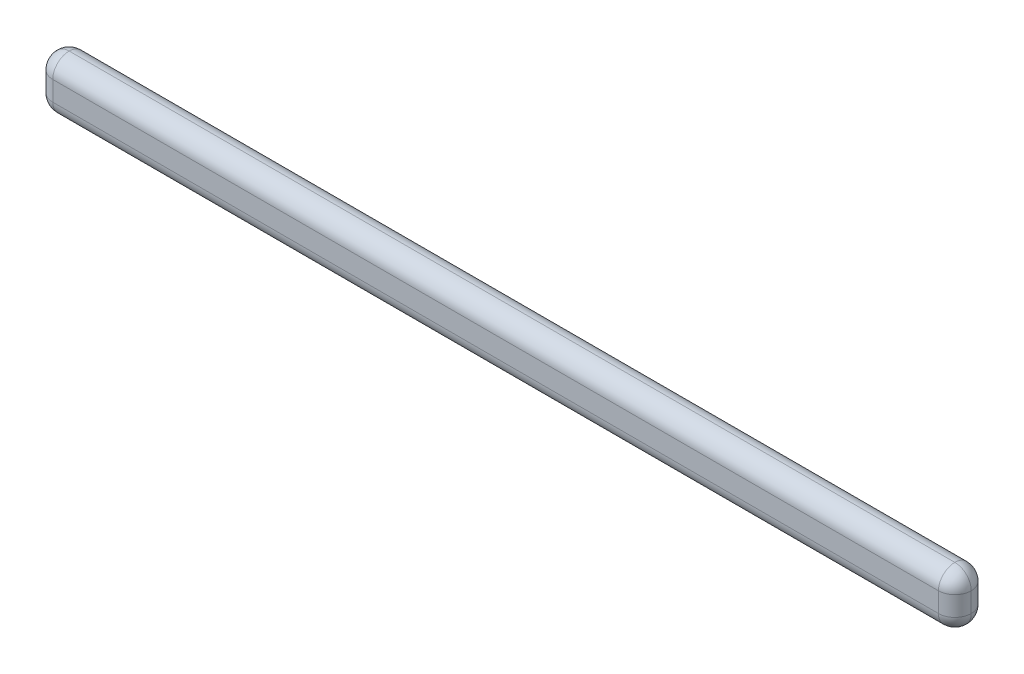
ISO-10303-21;
HEADER;
FILE_DESCRIPTION(('STEP AP214'),'2;1');
FILE_NAME('part.step','',(''),(''),'','','');
FILE_SCHEMA(('AUTOMOTIVE_DESIGN { 1 0 10303 214 1 1 1 1 }'));
ENDSEC;
DATA;
#1=APPLICATION_CONTEXT('core data for automotive mechanical design processes');
#2=APPLICATION_PROTOCOL_DEFINITION('international standard','automotive_design',2000,#1);
#3=PRODUCT_CONTEXT('',#1,'mechanical');
#4=PRODUCT('Part','Part','',(#3));
#5=PRODUCT_RELATED_PRODUCT_CATEGORY('part','',(#4));
#6=PRODUCT_DEFINITION_FORMATION('','',#4);
#7=PRODUCT_DEFINITION_CONTEXT('part definition',#1,'design');
#8=PRODUCT_DEFINITION('design','',#6,#7);
#9=PRODUCT_DEFINITION_SHAPE('','',#8);
#10=(LENGTH_UNIT() NAMED_UNIT(*) SI_UNIT(.MILLI.,.METRE.));
#11=(NAMED_UNIT(*) PLANE_ANGLE_UNIT() SI_UNIT($,.RADIAN.));
#12=(NAMED_UNIT(*) SI_UNIT($,.STERADIAN.) SOLID_ANGLE_UNIT());
#13=UNCERTAINTY_MEASURE_WITH_UNIT(LENGTH_MEASURE(1.E-05),#10,'distance_accuracy_value','');
#14=(GEOMETRIC_REPRESENTATION_CONTEXT(3) GLOBAL_UNCERTAINTY_ASSIGNED_CONTEXT((#13)) GLOBAL_UNIT_ASSIGNED_CONTEXT((#10,
#11,#12)) REPRESENTATION_CONTEXT('',''));
#15=CARTESIAN_POINT('',(0.,0.,0.));
#16=DIRECTION('',(0.,0.,1.));
#17=DIRECTION('',(1.,0.,0.));
#18=AXIS2_PLACEMENT_3D('',#15,#16,#17);
#19=CARTESIAN_POINT('',(0.,0.,-12.5));
#20=DIRECTION('',(0.,0.,-1.));
#21=DIRECTION('',(-1.,0.,0.));
#22=AXIS2_PLACEMENT_3D('',#19,#20,#21);
#23=PLANE('',#22);
#24=DIRECTION('',(1.,0.,0.));
#25=VECTOR('',#24,1.);
#26=CARTESIAN_POINT('',(0.,-7.5,-12.5));
#27=LINE('',#26,#25);
#28=CARTESIAN_POINT('',(337.5,-7.5,-12.5));
#29=VERTEX_POINT('',#28);
#30=CARTESIAN_POINT('',(-337.5,-7.5,-12.5));
#31=VERTEX_POINT('',#30);
#32=EDGE_CURVE('E168',#29,#31,#27,.F.);
#33=ORIENTED_EDGE('',*,*,#32,.T.);
#34=DIRECTION('',(0.,-1.,0.));
#35=VECTOR('',#34,1.);
#36=CARTESIAN_POINT('',(-337.5,0.,-12.5));
#37=LINE('',#36,#35);
#38=CARTESIAN_POINT('',(-337.5,7.5,-12.5));
#39=VERTEX_POINT('',#38);
#40=EDGE_CURVE('E11',#31,#39,#37,.F.);
#41=ORIENTED_EDGE('',*,*,#40,.T.);
#42=DIRECTION('',(-1.,0.,0.));
#43=VECTOR('',#42,1.);
#44=CARTESIAN_POINT('',(0.,7.5,-12.5));
#45=LINE('',#44,#43);
#46=CARTESIAN_POINT('',(337.5,7.5,-12.5));
#47=VERTEX_POINT('',#46);
#48=EDGE_CURVE('E163',#39,#47,#45,.F.);
#49=ORIENTED_EDGE('',*,*,#48,.T.);
#50=DIRECTION('',(0.,1.,0.));
#51=VECTOR('',#50,1.);
#52=CARTESIAN_POINT('',(337.5,0.,-12.5));
#53=LINE('',#52,#51);
#54=EDGE_CURVE('E45',#47,#29,#53,.F.);
#55=ORIENTED_EDGE('',*,*,#54,.T.);
#56=EDGE_LOOP('',(#33,#41,#49,#55));
#57=FACE_BOUND('',#56,.T.);
#58=ADVANCED_FACE('F35',(#57),#23,.T.);
#59=CARTESIAN_POINT('',(0.,0.,12.5));
#60=DIRECTION('',(0.,0.,-1.));
#61=DIRECTION('',(-1.,0.,0.));
#62=AXIS2_PLACEMENT_3D('',#59,#60,#61);
#63=PLANE('',#62);
#64=DIRECTION('',(-1.,0.,0.));
#65=VECTOR('',#64,1.);
#66=CARTESIAN_POINT('',(-350.,7.5,12.5));
#67=LINE('',#66,#65);
#68=CARTESIAN_POINT('',(337.5,7.5,12.5));
#69=VERTEX_POINT('',#68);
#70=CARTESIAN_POINT('',(-337.5,7.5,12.5));
#71=VERTEX_POINT('',#70);
#72=EDGE_CURVE('E166',#69,#71,#67,.T.);
#73=ORIENTED_EDGE('',*,*,#72,.T.);
#74=DIRECTION('',(0.,-1.,0.));
#75=VECTOR('',#74,1.);
#76=CARTESIAN_POINT('',(-337.5,-7.5,12.5));
#77=LINE('',#76,#75);
#78=CARTESIAN_POINT('',(-337.5,-7.5,12.5));
#79=VERTEX_POINT('',#78);
#80=EDGE_CURVE('E134',#71,#79,#77,.T.);
#81=ORIENTED_EDGE('',*,*,#80,.T.);
#82=DIRECTION('',(1.,0.,0.));
#83=VECTOR('',#82,1.);
#84=CARTESIAN_POINT('',(350.,-7.5,12.5));
#85=LINE('',#84,#83);
#86=CARTESIAN_POINT('',(337.5,-7.5,12.5));
#87=VERTEX_POINT('',#86);
#88=EDGE_CURVE('E157',#79,#87,#85,.T.);
#89=ORIENTED_EDGE('',*,*,#88,.T.);
#90=DIRECTION('',(0.,1.,0.));
#91=VECTOR('',#90,1.);
#92=CARTESIAN_POINT('',(337.5,7.5,12.5));
#93=LINE('',#92,#91);
#94=EDGE_CURVE('E137',#87,#69,#93,.T.);
#95=ORIENTED_EDGE('',*,*,#94,.T.);
#96=EDGE_LOOP('',(#73,#81,#89,#95));
#97=FACE_BOUND('',#96,.T.);
#98=ADVANCED_FACE('F219',(#97),#63,.F.);
#99=CARTESIAN_POINT('',(0.,-7.5,0.));
#100=DIRECTION('',(-1.,0.,0.));
#101=DIRECTION('',(0.,0.,1.));
#102=AXIS2_PLACEMENT_3D('',#99,#100,#101);
#103=CYLINDRICAL_SURFACE('',#102,12.5);
#104=ORIENTED_EDGE('',*,*,#88,.F.);
#105=CARTESIAN_POINT('',(-337.5,-7.5,0.));
#106=DIRECTION('',(-1.,0.,0.));
#107=DIRECTION('',(0.,0.,1.));
#108=AXIS2_PLACEMENT_3D('',#105,#106,#107);
#109=CIRCLE('',#108,12.5);
#110=CARTESIAN_POINT('',(-337.5,-20.,0.));
#111=VERTEX_POINT('',#110);
#112=EDGE_CURVE('E147',#79,#111,#109,.F.);
#113=ORIENTED_EDGE('',*,*,#112,.T.);
#114=DIRECTION('',(1.,0.,0.));
#115=VECTOR('',#114,1.);
#116=CARTESIAN_POINT('',(-350.,-20.,0.));
#117=LINE('',#116,#115);
#118=CARTESIAN_POINT('',(337.5,-20.,0.));
#119=VERTEX_POINT('',#118);
#120=EDGE_CURVE('E160',#119,#111,#117,.F.);
#121=ORIENTED_EDGE('',*,*,#120,.F.);
#122=CARTESIAN_POINT('',(337.5,-7.5,0.));
#123=DIRECTION('',(-1.,0.,0.));
#124=DIRECTION('',(0.,0.,1.));
#125=AXIS2_PLACEMENT_3D('',#122,#123,#124);
#126=CIRCLE('',#125,12.5);
#127=EDGE_CURVE('E150',#119,#87,#126,.T.);
#128=ORIENTED_EDGE('',*,*,#127,.T.);
#129=EDGE_LOOP('',(#104,#113,#121,#128));
#130=FACE_BOUND('',#129,.T.);
#131=ADVANCED_FACE('F221',(#130),#103,.T.);
#132=CARTESIAN_POINT('',(350.,-7.5,0.));
#133=DIRECTION('',(1.,0.,0.));
#134=DIRECTION('',(0.,0.,-1.));
#135=AXIS2_PLACEMENT_3D('',#132,#133,#134);
#136=CYLINDRICAL_SURFACE('',#135,12.5);
#137=ORIENTED_EDGE('',*,*,#120,.T.);
#138=CARTESIAN_POINT('',(-337.5,-7.5,0.));
#139=DIRECTION('',(1.,0.,0.));
#140=DIRECTION('',(0.,0.,-1.));
#141=AXIS2_PLACEMENT_3D('',#138,#139,#140);
#142=CIRCLE('',#141,12.5);
#143=EDGE_CURVE('E141',#111,#31,#142,.T.);
#144=ORIENTED_EDGE('',*,*,#143,.T.);
#145=ORIENTED_EDGE('',*,*,#32,.F.);
#146=CARTESIAN_POINT('',(337.5,-7.5,0.));
#147=DIRECTION('',(1.,0.,0.));
#148=DIRECTION('',(0.,0.,-1.));
#149=AXIS2_PLACEMENT_3D('',#146,#147,#148);
#150=CIRCLE('',#149,12.5);
#151=EDGE_CURVE('E144',#29,#119,#150,.F.);
#152=ORIENTED_EDGE('',*,*,#151,.T.);
#153=EDGE_LOOP('',(#137,#144,#145,#152));
#154=FACE_BOUND('',#153,.T.);
#155=ADVANCED_FACE('F207',(#154),#136,.T.);
#156=CARTESIAN_POINT('',(0.,7.5,0.));
#157=DIRECTION('',(1.,0.,0.));
#158=DIRECTION('',(0.,0.,-1.));
#159=AXIS2_PLACEMENT_3D('',#156,#157,#158);
#160=CYLINDRICAL_SURFACE('',#159,12.5);
#161=ORIENTED_EDGE('',*,*,#72,.F.);
#162=CARTESIAN_POINT('',(337.5,7.5,0.));
#163=DIRECTION('',(1.,0.,0.));
#164=DIRECTION('',(0.,0.,-1.));
#165=AXIS2_PLACEMENT_3D('',#162,#163,#164);
#166=CIRCLE('',#165,12.5);
#167=CARTESIAN_POINT('',(337.5,20.,0.));
#168=VERTEX_POINT('',#167);
#169=EDGE_CURVE('E96',#69,#168,#166,.F.);
#170=ORIENTED_EDGE('',*,*,#169,.T.);
#171=DIRECTION('',(-1.,0.,0.));
#172=VECTOR('',#171,1.);
#173=CARTESIAN_POINT('',(350.,20.,0.));
#174=LINE('',#173,#172);
#175=CARTESIAN_POINT('',(-337.5,20.,0.));
#176=VERTEX_POINT('',#175);
#177=EDGE_CURVE('E115',#176,#168,#174,.F.);
#178=ORIENTED_EDGE('',*,*,#177,.F.);
#179=CARTESIAN_POINT('',(-337.5,7.5,0.));
#180=DIRECTION('',(1.,0.,0.));
#181=DIRECTION('',(0.,0.,-1.));
#182=AXIS2_PLACEMENT_3D('',#179,#180,#181);
#183=CIRCLE('',#182,12.5);
#184=EDGE_CURVE('E54',#176,#71,#183,.T.);
#185=ORIENTED_EDGE('',*,*,#184,.T.);
#186=EDGE_LOOP('',(#161,#170,#178,#185));
#187=FACE_BOUND('',#186,.T.);
#188=ADVANCED_FACE('F246',(#187),#160,.T.);
#189=CARTESIAN_POINT('',(-350.,7.5,0.));
#190=DIRECTION('',(-1.,0.,0.));
#191=DIRECTION('',(0.,0.,1.));
#192=AXIS2_PLACEMENT_3D('',#189,#190,#191);
#193=CYLINDRICAL_SURFACE('',#192,12.5);
#194=ORIENTED_EDGE('',*,*,#48,.F.);
#195=CARTESIAN_POINT('',(-337.5,7.5,0.));
#196=DIRECTION('',(-1.,0.,0.));
#197=DIRECTION('',(0.,0.,1.));
#198=AXIS2_PLACEMENT_3D('',#195,#196,#197);
#199=CIRCLE('',#198,12.5);
#200=EDGE_CURVE('E153',#39,#176,#199,.F.);
#201=ORIENTED_EDGE('',*,*,#200,.T.);
#202=ORIENTED_EDGE('',*,*,#177,.T.);
#203=CARTESIAN_POINT('',(337.5,7.5,0.));
#204=DIRECTION('',(-1.,0.,0.));
#205=DIRECTION('',(0.,0.,1.));
#206=AXIS2_PLACEMENT_3D('',#203,#204,#205);
#207=CIRCLE('',#206,12.5);
#208=EDGE_CURVE('E85',#168,#47,#207,.T.);
#209=ORIENTED_EDGE('',*,*,#208,.T.);
#210=EDGE_LOOP('',(#194,#201,#202,#209));
#211=FACE_BOUND('',#210,.T.);
#212=ADVANCED_FACE('F181',(#211),#193,.T.);
#213=CARTESIAN_POINT('',(-337.5,-7.5,0.));
#214=DIRECTION('',(-1.,0.,0.));
#215=DIRECTION('',(0.,0.,1.));
#216=AXIS2_PLACEMENT_3D('',#213,#214,#215);
#217=SPHERICAL_SURFACE('',#216,12.5);
#218=CARTESIAN_POINT('',(-337.5,-7.5,0.));
#219=DIRECTION('',(0.,0.,-1.));
#220=DIRECTION('',(-1.,0.,0.));
#221=AXIS2_PLACEMENT_3D('',#218,#219,#220);
#222=CIRCLE('',#221,12.5);
#223=CARTESIAN_POINT('',(-350.,-7.5,0.));
#224=VERTEX_POINT('',#223);
#225=EDGE_CURVE('E116',#111,#224,#222,.T.);
#226=ORIENTED_EDGE('',*,*,#225,.F.);
#227=ORIENTED_EDGE('',*,*,#112,.F.);
#228=CARTESIAN_POINT('',(-337.5,-7.5,0.));
#229=DIRECTION('',(0.,1.,0.));
#230=DIRECTION('',(0.,0.,1.));
#231=AXIS2_PLACEMENT_3D('',#228,#229,#230);
#232=CIRCLE('',#231,12.5);
#233=EDGE_CURVE('E112',#224,#79,#232,.T.);
#234=ORIENTED_EDGE('',*,*,#233,.F.);
#235=EDGE_LOOP('',(#226,#227,#234));
#236=FACE_BOUND('',#235,.T.);
#237=ADVANCED_FACE('F214',(#236),#217,.T.);
#238=CARTESIAN_POINT('',(-337.5,0.,0.));
#239=DIRECTION('',(0.,1.,0.));
#240=DIRECTION('',(0.,0.,1.));
#241=AXIS2_PLACEMENT_3D('',#238,#239,#240);
#242=CYLINDRICAL_SURFACE('',#241,12.5);
#243=ORIENTED_EDGE('',*,*,#233,.T.);
#244=ORIENTED_EDGE('',*,*,#80,.F.);
#245=CARTESIAN_POINT('',(-337.5,7.5,0.));
#246=DIRECTION('',(0.,1.,0.));
#247=DIRECTION('',(0.,0.,1.));
#248=AXIS2_PLACEMENT_3D('',#245,#246,#247);
#249=CIRCLE('',#248,12.5);
#250=CARTESIAN_POINT('',(-350.,7.5,0.));
#251=VERTEX_POINT('',#250);
#252=EDGE_CURVE('E119',#251,#71,#249,.T.);
#253=ORIENTED_EDGE('',*,*,#252,.F.);
#254=DIRECTION('',(0.,-1.,0.));
#255=VECTOR('',#254,1.);
#256=CARTESIAN_POINT('',(-350.,7.5,0.));
#257=LINE('',#256,#255);
#258=EDGE_CURVE('E122',#224,#251,#257,.F.);
#259=ORIENTED_EDGE('',*,*,#258,.F.);
#260=EDGE_LOOP('',(#243,#244,#253,#259));
#261=FACE_BOUND('',#260,.T.);
#262=ADVANCED_FACE('F216',(#261),#242,.T.);
#263=CARTESIAN_POINT('',(-337.5,-7.5,0.));
#264=DIRECTION('',(-1.,0.,0.));
#265=DIRECTION('',(0.,0.,1.));
#266=AXIS2_PLACEMENT_3D('',#263,#264,#265);
#267=SPHERICAL_SURFACE('',#266,12.5);
#268=ORIENTED_EDGE('',*,*,#143,.F.);
#269=ORIENTED_EDGE('',*,*,#225,.T.);
#270=CARTESIAN_POINT('',(-337.5,-7.5,0.));
#271=DIRECTION('',(0.,1.,0.));
#272=DIRECTION('',(0.,0.,1.));
#273=AXIS2_PLACEMENT_3D('',#270,#271,#272);
#274=CIRCLE('',#273,12.5);
#275=EDGE_CURVE('E125',#31,#224,#274,.T.);
#276=ORIENTED_EDGE('',*,*,#275,.F.);
#277=EDGE_LOOP('',(#268,#269,#276));
#278=FACE_BOUND('',#277,.T.);
#279=ADVANCED_FACE('F211',(#278),#267,.T.);
#280=CARTESIAN_POINT('',(-337.5,7.5,0.));
#281=DIRECTION('',(-1.,0.,0.));
#282=DIRECTION('',(0.,0.,1.));
#283=AXIS2_PLACEMENT_3D('',#280,#281,#282);
#284=SPHERICAL_SURFACE('',#283,12.5);
#285=ORIENTED_EDGE('',*,*,#252,.T.);
#286=ORIENTED_EDGE('',*,*,#184,.F.);
#287=CARTESIAN_POINT('',(-337.5,7.5,0.));
#288=DIRECTION('',(0.,0.,-1.));
#289=DIRECTION('',(-1.,0.,0.));
#290=AXIS2_PLACEMENT_3D('',#287,#288,#289);
#291=CIRCLE('',#290,12.5);
#292=EDGE_CURVE('E128',#251,#176,#291,.T.);
#293=ORIENTED_EDGE('',*,*,#292,.F.);
#294=EDGE_LOOP('',(#285,#286,#293));
#295=FACE_BOUND('',#294,.T.);
#296=ADVANCED_FACE('F193',(#295),#284,.T.);
#297=CARTESIAN_POINT('',(-337.5,-20.,0.));
#298=DIRECTION('',(0.,-1.,0.));
#299=DIRECTION('',(0.,0.,-1.));
#300=AXIS2_PLACEMENT_3D('',#297,#298,#299);
#301=CYLINDRICAL_SURFACE('',#300,12.5);
#302=ORIENTED_EDGE('',*,*,#275,.T.);
#303=ORIENTED_EDGE('',*,*,#258,.T.);
#304=CARTESIAN_POINT('',(-337.5,7.5,0.));
#305=DIRECTION('',(0.,1.,0.));
#306=DIRECTION('',(0.,0.,1.));
#307=AXIS2_PLACEMENT_3D('',#304,#305,#306);
#308=CIRCLE('',#307,12.5);
#309=EDGE_CURVE('E89',#39,#251,#308,.T.);
#310=ORIENTED_EDGE('',*,*,#309,.F.);
#311=ORIENTED_EDGE('',*,*,#40,.F.);
#312=EDGE_LOOP('',(#302,#303,#310,#311));
#313=FACE_BOUND('',#312,.T.);
#314=ADVANCED_FACE('F188',(#313),#301,.T.);
#315=CARTESIAN_POINT('',(-337.5,7.5,0.));
#316=DIRECTION('',(-1.,0.,0.));
#317=DIRECTION('',(0.,0.,1.));
#318=AXIS2_PLACEMENT_3D('',#315,#316,#317);
#319=SPHERICAL_SURFACE('',#318,12.5);
#320=ORIENTED_EDGE('',*,*,#292,.T.);
#321=ORIENTED_EDGE('',*,*,#200,.F.);
#322=ORIENTED_EDGE('',*,*,#309,.T.);
#323=EDGE_LOOP('',(#320,#321,#322));
#324=FACE_BOUND('',#323,.T.);
#325=ADVANCED_FACE('F185',(#324),#319,.T.);
#326=CARTESIAN_POINT('',(337.5,7.5,0.));
#327=DIRECTION('',(1.,0.,0.));
#328=DIRECTION('',(0.,0.,-1.));
#329=AXIS2_PLACEMENT_3D('',#326,#327,#328);
#330=SPHERICAL_SURFACE('',#329,12.5);
#331=CARTESIAN_POINT('',(337.5,7.5,0.));
#332=DIRECTION('',(0.,-1.,0.));
#333=DIRECTION('',(0.,0.,-1.));
#334=AXIS2_PLACEMENT_3D('',#331,#332,#333);
#335=CIRCLE('',#334,12.5);
#336=CARTESIAN_POINT('',(350.,7.5,0.));
#337=VERTEX_POINT('',#336);
#338=EDGE_CURVE('E81',#47,#337,#335,.T.);
#339=ORIENTED_EDGE('',*,*,#338,.F.);
#340=ORIENTED_EDGE('',*,*,#208,.F.);
#341=CARTESIAN_POINT('',(337.5,7.5,0.));
#342=DIRECTION('',(0.,0.,1.));
#343=DIRECTION('',(1.,0.,0.));
#344=AXIS2_PLACEMENT_3D('',#341,#342,#343);
#345=CIRCLE('',#344,12.5);
#346=EDGE_CURVE('E39',#337,#168,#345,.T.);
#347=ORIENTED_EDGE('',*,*,#346,.F.);
#348=EDGE_LOOP('',(#339,#340,#347));
#349=FACE_BOUND('',#348,.T.);
#350=ADVANCED_FACE('F37',(#349),#330,.T.);
#351=CARTESIAN_POINT('',(337.5,7.5,0.));
#352=DIRECTION('',(1.,0.,0.));
#353=DIRECTION('',(0.,0.,-1.));
#354=AXIS2_PLACEMENT_3D('',#351,#352,#353);
#355=SPHERICAL_SURFACE('',#354,12.5);
#356=ORIENTED_EDGE('',*,*,#346,.T.);
#357=ORIENTED_EDGE('',*,*,#169,.F.);
#358=CARTESIAN_POINT('',(337.5,7.5,0.));
#359=DIRECTION('',(0.,-1.,0.));
#360=DIRECTION('',(0.,0.,-1.));
#361=AXIS2_PLACEMENT_3D('',#358,#359,#360);
#362=CIRCLE('',#361,12.5);
#363=EDGE_CURVE('E92',#337,#69,#362,.T.);
#364=ORIENTED_EDGE('',*,*,#363,.F.);
#365=EDGE_LOOP('',(#356,#357,#364));
#366=FACE_BOUND('',#365,.T.);
#367=ADVANCED_FACE('F94',(#366),#355,.T.);
#368=CARTESIAN_POINT('',(337.5,20.,0.));
#369=DIRECTION('',(0.,1.,0.));
#370=DIRECTION('',(0.,0.,1.));
#371=AXIS2_PLACEMENT_3D('',#368,#369,#370);
#372=CYLINDRICAL_SURFACE('',#371,12.5);
#373=ORIENTED_EDGE('',*,*,#54,.F.);
#374=ORIENTED_EDGE('',*,*,#338,.T.);
#375=DIRECTION('',(0.,1.,0.));
#376=VECTOR('',#375,1.);
#377=CARTESIAN_POINT('',(350.,20.,0.));
#378=LINE('',#377,#376);
#379=CARTESIAN_POINT('',(350.,-7.5,0.));
#380=VERTEX_POINT('',#379);
#381=EDGE_CURVE('E73',#380,#337,#378,.T.);
#382=ORIENTED_EDGE('',*,*,#381,.F.);
#383=CARTESIAN_POINT('',(337.5,-7.5,0.));
#384=DIRECTION('',(0.,-1.,0.));
#385=DIRECTION('',(0.,0.,-1.));
#386=AXIS2_PLACEMENT_3D('',#383,#384,#385);
#387=CIRCLE('',#386,12.5);
#388=EDGE_CURVE('E105',#29,#380,#387,.T.);
#389=ORIENTED_EDGE('',*,*,#388,.F.);
#390=EDGE_LOOP('',(#373,#374,#382,#389));
#391=FACE_BOUND('',#390,.T.);
#392=ADVANCED_FACE('F90',(#391),#372,.T.);
#393=CARTESIAN_POINT('',(337.5,0.,0.));
#394=DIRECTION('',(0.,-1.,0.));
#395=DIRECTION('',(0.,0.,-1.));
#396=AXIS2_PLACEMENT_3D('',#393,#394,#395);
#397=CYLINDRICAL_SURFACE('',#396,12.5);
#398=ORIENTED_EDGE('',*,*,#363,.T.);
#399=ORIENTED_EDGE('',*,*,#94,.F.);
#400=CARTESIAN_POINT('',(337.5,-7.5,0.));
#401=DIRECTION('',(0.,-1.,0.));
#402=DIRECTION('',(0.,0.,-1.));
#403=AXIS2_PLACEMENT_3D('',#400,#401,#402);
#404=CIRCLE('',#403,12.5);
#405=EDGE_CURVE('E103',#380,#87,#404,.T.);
#406=ORIENTED_EDGE('',*,*,#405,.F.);
#407=ORIENTED_EDGE('',*,*,#381,.T.);
#408=EDGE_LOOP('',(#398,#399,#406,#407));
#409=FACE_BOUND('',#408,.T.);
#410=ADVANCED_FACE('F101',(#409),#397,.T.);
#411=CARTESIAN_POINT('',(337.5,-7.5,0.));
#412=DIRECTION('',(1.,0.,0.));
#413=DIRECTION('',(0.,0.,-1.));
#414=AXIS2_PLACEMENT_3D('',#411,#412,#413);
#415=SPHERICAL_SURFACE('',#414,12.5);
#416=ORIENTED_EDGE('',*,*,#151,.F.);
#417=ORIENTED_EDGE('',*,*,#388,.T.);
#418=CARTESIAN_POINT('',(337.5,-7.5,0.));
#419=DIRECTION('',(0.,0.,1.));
#420=DIRECTION('',(1.,0.,0.));
#421=AXIS2_PLACEMENT_3D('',#418,#419,#420);
#422=CIRCLE('',#421,12.5);
#423=EDGE_CURVE('E110',#119,#380,#422,.T.);
#424=ORIENTED_EDGE('',*,*,#423,.F.);
#425=EDGE_LOOP('',(#416,#417,#424));
#426=FACE_BOUND('',#425,.T.);
#427=ADVANCED_FACE('F228',(#426),#415,.T.);
#428=CARTESIAN_POINT('',(337.5,-7.5,0.));
#429=DIRECTION('',(1.,0.,0.));
#430=DIRECTION('',(0.,0.,-1.));
#431=AXIS2_PLACEMENT_3D('',#428,#429,#430);
#432=SPHERICAL_SURFACE('',#431,12.5);
#433=ORIENTED_EDGE('',*,*,#405,.T.);
#434=ORIENTED_EDGE('',*,*,#127,.F.);
#435=ORIENTED_EDGE('',*,*,#423,.T.);
#436=EDGE_LOOP('',(#433,#434,#435));
#437=FACE_BOUND('',#436,.T.);
#438=ADVANCED_FACE('F225',(#437),#432,.T.);
#439=CLOSED_SHELL('',(#58,#98,#131,#155,#188,#212,#237,#262,#279,#296,#314,#325,#350,#367,#392,
#410,#427,#438));
#440=MANIFOLD_SOLID_BREP('B2',#439);
#441=ADVANCED_BREP_SHAPE_REPRESENTATION('',(#18,#440),#14);
#442=SHAPE_DEFINITION_REPRESENTATION(#9,#441);
ENDSEC;
END-ISO-10303-21;
